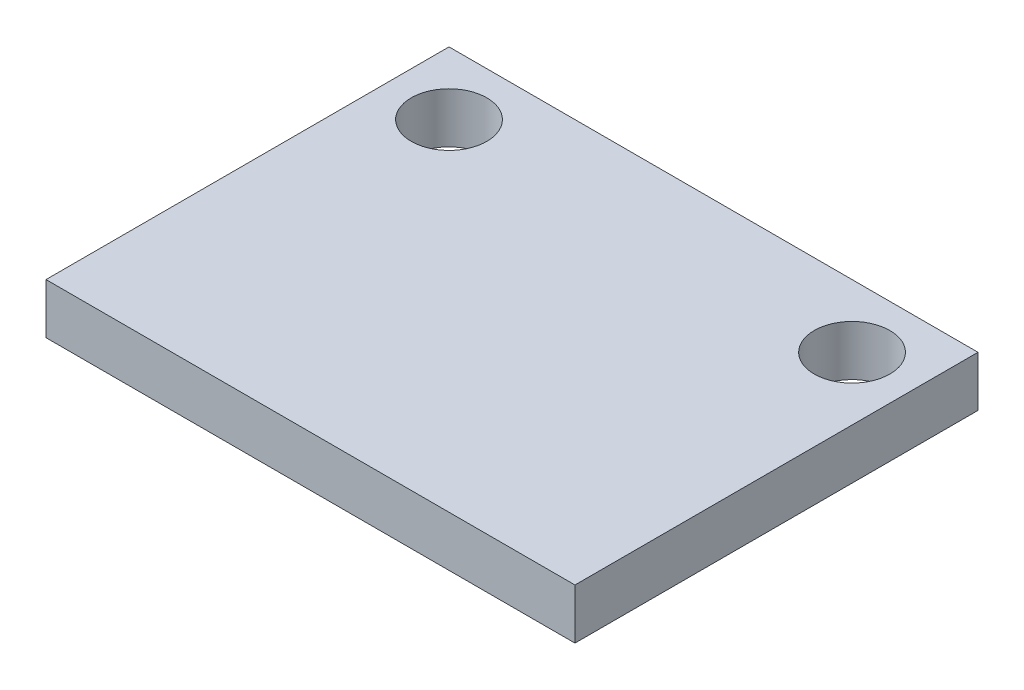
ISO-10303-21;
HEADER;
FILE_DESCRIPTION(('STEP AP214'),'2;1');
FILE_NAME('part.step','',(''),(''),'','','');
FILE_SCHEMA(('AUTOMOTIVE_DESIGN { 1 0 10303 214 1 1 1 1 }'));
ENDSEC;
DATA;
#1=APPLICATION_CONTEXT('core data for automotive mechanical design processes');
#2=APPLICATION_PROTOCOL_DEFINITION('international standard','automotive_design',2000,#1);
#3=PRODUCT_CONTEXT('',#1,'mechanical');
#4=PRODUCT('Part','Part','',(#3));
#5=PRODUCT_RELATED_PRODUCT_CATEGORY('part','',(#4));
#6=PRODUCT_DEFINITION_FORMATION('','',#4);
#7=PRODUCT_DEFINITION_CONTEXT('part definition',#1,'design');
#8=PRODUCT_DEFINITION('design','',#6,#7);
#9=PRODUCT_DEFINITION_SHAPE('','',#8);
#10=(LENGTH_UNIT() NAMED_UNIT(*) SI_UNIT(.MILLI.,.METRE.));
#11=(NAMED_UNIT(*) PLANE_ANGLE_UNIT() SI_UNIT($,.RADIAN.));
#12=(NAMED_UNIT(*) SI_UNIT($,.STERADIAN.) SOLID_ANGLE_UNIT());
#13=UNCERTAINTY_MEASURE_WITH_UNIT(LENGTH_MEASURE(1.E-05),#10,'distance_accuracy_value','');
#14=(GEOMETRIC_REPRESENTATION_CONTEXT(3) GLOBAL_UNCERTAINTY_ASSIGNED_CONTEXT((#13)) GLOBAL_UNIT_ASSIGNED_CONTEXT((#10,
#11,#12)) REPRESENTATION_CONTEXT('',''));
#15=CARTESIAN_POINT('',(0.,0.,0.));
#16=DIRECTION('',(0.,0.,1.));
#17=DIRECTION('',(1.,0.,0.));
#18=AXIS2_PLACEMENT_3D('',#15,#16,#17);
#19=CARTESIAN_POINT('',(0.,2.,0.));
#20=DIRECTION('',(0.,1.,0.));
#21=DIRECTION('',(0.,0.,1.));
#22=AXIS2_PLACEMENT_3D('',#19,#20,#21);
#23=PLANE('',#22);
#24=CARTESIAN_POINT('',(2.5,2.,2.5));
#25=DIRECTION('',(0.,1.,0.));
#26=DIRECTION('',(0.,0.,1.));
#27=AXIS2_PLACEMENT_3D('',#24,#25,#26);
#28=CIRCLE('',#27,1.5);
#29=CARTESIAN_POINT('',(2.5,2.,4.));
#30=VERTEX_POINT('',#29);
#31=EDGE_CURVE('E100',#30,#30,#28,.T.);
#32=ORIENTED_EDGE('',*,*,#31,.F.);
#33=EDGE_LOOP('',(#32));
#34=FACE_BOUND('',#33,.T.);
#35=DIRECTION('',(0.,0.,1.));
#36=VECTOR('',#35,1.);
#37=CARTESIAN_POINT('',(0.,2.,0.));
#38=LINE('',#37,#36);
#39=CARTESIAN_POINT('',(0.,2.,0.));
#40=VERTEX_POINT('',#39);
#41=CARTESIAN_POINT('',(0.,2.,16.));
#42=VERTEX_POINT('',#41);
#43=EDGE_CURVE('E85',#40,#42,#38,.T.);
#44=ORIENTED_EDGE('',*,*,#43,.T.);
#45=DIRECTION('',(1.,0.,0.));
#46=VECTOR('',#45,1.);
#47=CARTESIAN_POINT('',(0.,2.,16.));
#48=LINE('',#47,#46);
#49=CARTESIAN_POINT('',(21.,2.,16.));
#50=VERTEX_POINT('',#49);
#51=EDGE_CURVE('E80',#42,#50,#48,.T.);
#52=ORIENTED_EDGE('',*,*,#51,.T.);
#53=DIRECTION('',(0.,0.,-1.));
#54=VECTOR('',#53,1.);
#55=CARTESIAN_POINT('',(21.,2.,0.));
#56=LINE('',#55,#54);
#57=CARTESIAN_POINT('',(21.,2.,0.));
#58=VERTEX_POINT('',#57);
#59=EDGE_CURVE('E83',#50,#58,#56,.T.);
#60=ORIENTED_EDGE('',*,*,#59,.T.);
#61=DIRECTION('',(-1.,0.,0.));
#62=VECTOR('',#61,1.);
#63=CARTESIAN_POINT('',(0.,2.,0.));
#64=LINE('',#63,#62);
#65=EDGE_CURVE('E50',#58,#40,#64,.T.);
#66=ORIENTED_EDGE('',*,*,#65,.T.);
#67=EDGE_LOOP('',(#44,#52,#60,#66));
#68=FACE_BOUND('',#67,.T.);
#69=CARTESIAN_POINT('',(18.5,2.,2.5));
#70=DIRECTION('',(0.,1.,0.));
#71=DIRECTION('',(0.,0.,1.));
#72=AXIS2_PLACEMENT_3D('',#69,#70,#71);
#73=CIRCLE('',#72,1.5);
#74=CARTESIAN_POINT('',(18.5,2.,4.));
#75=VERTEX_POINT('',#74);
#76=EDGE_CURVE('E115',#75,#75,#73,.T.);
#77=ORIENTED_EDGE('',*,*,#76,.F.);
#78=EDGE_LOOP('',(#77));
#79=FACE_BOUND('',#78,.T.);
#80=ADVANCED_FACE('F33',(#34,#68,#79),#23,.T.);
#81=CARTESIAN_POINT('',(0.,0.,0.));
#82=DIRECTION('',(0.,1.,0.));
#83=DIRECTION('',(0.,0.,1.));
#84=AXIS2_PLACEMENT_3D('',#81,#82,#83);
#85=PLANE('',#84);
#86=CARTESIAN_POINT('',(2.5,0.,2.5));
#87=DIRECTION('',(0.,1.,0.));
#88=DIRECTION('',(0.,0.,1.));
#89=AXIS2_PLACEMENT_3D('',#86,#87,#88);
#90=CIRCLE('',#89,1.5);
#91=CARTESIAN_POINT('',(2.5,0.,4.));
#92=VERTEX_POINT('',#91);
#93=EDGE_CURVE('E112',#92,#92,#90,.T.);
#94=ORIENTED_EDGE('',*,*,#93,.T.);
#95=EDGE_LOOP('',(#94));
#96=FACE_BOUND('',#95,.T.);
#97=DIRECTION('',(0.,0.,1.));
#98=VECTOR('',#97,1.);
#99=CARTESIAN_POINT('',(0.,0.,0.));
#100=LINE('',#99,#98);
#101=CARTESIAN_POINT('',(0.,0.,0.));
#102=VERTEX_POINT('',#101);
#103=CARTESIAN_POINT('',(0.,0.,16.));
#104=VERTEX_POINT('',#103);
#105=EDGE_CURVE('E97',#102,#104,#100,.T.);
#106=ORIENTED_EDGE('',*,*,#105,.F.);
#107=DIRECTION('',(-1.,0.,0.));
#108=VECTOR('',#107,1.);
#109=CARTESIAN_POINT('',(0.,0.,0.));
#110=LINE('',#109,#108);
#111=CARTESIAN_POINT('',(21.,0.,0.));
#112=VERTEX_POINT('',#111);
#113=EDGE_CURVE('E73',#112,#102,#110,.T.);
#114=ORIENTED_EDGE('',*,*,#113,.F.);
#115=DIRECTION('',(0.,0.,-1.));
#116=VECTOR('',#115,1.);
#117=CARTESIAN_POINT('',(21.,0.,0.));
#118=LINE('',#117,#116);
#119=CARTESIAN_POINT('',(21.,0.,16.));
#120=VERTEX_POINT('',#119);
#121=EDGE_CURVE('E67',#120,#112,#118,.T.);
#122=ORIENTED_EDGE('',*,*,#121,.F.);
#123=DIRECTION('',(1.,0.,0.));
#124=VECTOR('',#123,1.);
#125=CARTESIAN_POINT('',(0.,0.,16.));
#126=LINE('',#125,#124);
#127=EDGE_CURVE('E89',#104,#120,#126,.T.);
#128=ORIENTED_EDGE('',*,*,#127,.F.);
#129=EDGE_LOOP('',(#106,#114,#122,#128));
#130=FACE_BOUND('',#129,.T.);
#131=CARTESIAN_POINT('',(18.5,0.,2.5));
#132=DIRECTION('',(0.,1.,0.));
#133=DIRECTION('',(0.,0.,1.));
#134=AXIS2_PLACEMENT_3D('',#131,#132,#133);
#135=CIRCLE('',#134,1.5);
#136=CARTESIAN_POINT('',(18.5,0.,4.));
#137=VERTEX_POINT('',#136);
#138=EDGE_CURVE('E118',#137,#137,#135,.T.);
#139=ORIENTED_EDGE('',*,*,#138,.T.);
#140=EDGE_LOOP('',(#139));
#141=FACE_BOUND('',#140,.T.);
#142=ADVANCED_FACE('F108',(#96,#130,#141),#85,.F.);
#143=CARTESIAN_POINT('',(0.,2.,0.));
#144=DIRECTION('',(1.,0.,0.));
#145=DIRECTION('',(0.,0.,-1.));
#146=AXIS2_PLACEMENT_3D('',#143,#144,#145);
#147=PLANE('',#146);
#148=ORIENTED_EDGE('',*,*,#105,.T.);
#149=DIRECTION('',(0.,-1.,0.));
#150=VECTOR('',#149,1.);
#151=CARTESIAN_POINT('',(0.,2.,16.));
#152=LINE('',#151,#150);
#153=EDGE_CURVE('E11',#42,#104,#152,.T.);
#154=ORIENTED_EDGE('',*,*,#153,.F.);
#155=ORIENTED_EDGE('',*,*,#43,.F.);
#156=DIRECTION('',(0.,-1.,0.));
#157=VECTOR('',#156,1.);
#158=CARTESIAN_POINT('',(0.,2.,0.));
#159=LINE('',#158,#157);
#160=EDGE_CURVE('E93',#40,#102,#159,.T.);
#161=ORIENTED_EDGE('',*,*,#160,.T.);
#162=EDGE_LOOP('',(#148,#154,#155,#161));
#163=FACE_BOUND('',#162,.T.);
#164=ADVANCED_FACE('F35',(#163),#147,.F.);
#165=CARTESIAN_POINT('',(0.,2.,16.));
#166=DIRECTION('',(0.,0.,-1.));
#167=DIRECTION('',(-1.,0.,0.));
#168=AXIS2_PLACEMENT_3D('',#165,#166,#167);
#169=PLANE('',#168);
#170=ORIENTED_EDGE('',*,*,#127,.T.);
#171=DIRECTION('',(0.,-1.,0.));
#172=VECTOR('',#171,1.);
#173=CARTESIAN_POINT('',(21.,2.,16.));
#174=LINE('',#173,#172);
#175=EDGE_CURVE('E42',#50,#120,#174,.T.);
#176=ORIENTED_EDGE('',*,*,#175,.F.);
#177=ORIENTED_EDGE('',*,*,#51,.F.);
#178=ORIENTED_EDGE('',*,*,#153,.T.);
#179=EDGE_LOOP('',(#170,#176,#177,#178));
#180=FACE_BOUND('',#179,.T.);
#181=ADVANCED_FACE('F88',(#180),#169,.F.);
#182=CARTESIAN_POINT('',(21.,2.,0.));
#183=DIRECTION('',(-1.,0.,0.));
#184=DIRECTION('',(0.,0.,1.));
#185=AXIS2_PLACEMENT_3D('',#182,#183,#184);
#186=PLANE('',#185);
#187=ORIENTED_EDGE('',*,*,#121,.T.);
#188=DIRECTION('',(0.,-1.,0.));
#189=VECTOR('',#188,1.);
#190=CARTESIAN_POINT('',(21.,2.,0.));
#191=LINE('',#190,#189);
#192=EDGE_CURVE('E90',#58,#112,#191,.T.);
#193=ORIENTED_EDGE('',*,*,#192,.F.);
#194=ORIENTED_EDGE('',*,*,#59,.F.);
#195=ORIENTED_EDGE('',*,*,#175,.T.);
#196=EDGE_LOOP('',(#187,#193,#194,#195));
#197=FACE_BOUND('',#196,.T.);
#198=ADVANCED_FACE('F91',(#197),#186,.F.);
#199=CARTESIAN_POINT('',(0.,2.,0.));
#200=DIRECTION('',(0.,0.,1.));
#201=DIRECTION('',(1.,0.,0.));
#202=AXIS2_PLACEMENT_3D('',#199,#200,#201);
#203=PLANE('',#202);
#204=ORIENTED_EDGE('',*,*,#113,.T.);
#205=ORIENTED_EDGE('',*,*,#160,.F.);
#206=ORIENTED_EDGE('',*,*,#65,.F.);
#207=ORIENTED_EDGE('',*,*,#192,.T.);
#208=EDGE_LOOP('',(#204,#205,#206,#207));
#209=FACE_BOUND('',#208,.T.);
#210=ADVANCED_FACE('F105',(#209),#203,.F.);
#211=CARTESIAN_POINT('',(2.5,2.,2.5));
#212=DIRECTION('',(0.,-1.,0.));
#213=DIRECTION('',(0.,0.,-1.));
#214=AXIS2_PLACEMENT_3D('',#211,#212,#213);
#215=CYLINDRICAL_SURFACE('',#214,1.5);
#216=ORIENTED_EDGE('',*,*,#31,.T.);
#217=EDGE_LOOP('',(#216));
#218=FACE_BOUND('',#217,.T.);
#219=ORIENTED_EDGE('',*,*,#93,.F.);
#220=EDGE_LOOP('',(#219));
#221=FACE_BOUND('',#220,.T.);
#222=ADVANCED_FACE('F136',(#218,#221),#215,.F.);
#223=CARTESIAN_POINT('',(18.5,2.,2.5));
#224=DIRECTION('',(0.,-1.,0.));
#225=DIRECTION('',(0.,0.,-1.));
#226=AXIS2_PLACEMENT_3D('',#223,#224,#225);
#227=CYLINDRICAL_SURFACE('',#226,1.5);
#228=ORIENTED_EDGE('',*,*,#76,.T.);
#229=EDGE_LOOP('',(#228));
#230=FACE_BOUND('',#229,.T.);
#231=ORIENTED_EDGE('',*,*,#138,.F.);
#232=EDGE_LOOP('',(#231));
#233=FACE_BOUND('',#232,.T.);
#234=ADVANCED_FACE('F124',(#230,#233),#227,.F.);
#235=CLOSED_SHELL('',(#80,#142,#164,#181,#198,#210,#222,#234));
#236=MANIFOLD_SOLID_BREP('B2',#235);
#237=ADVANCED_BREP_SHAPE_REPRESENTATION('',(#18,#236),#14);
#238=SHAPE_DEFINITION_REPRESENTATION(#9,#237);
ENDSEC;
END-ISO-10303-21;
